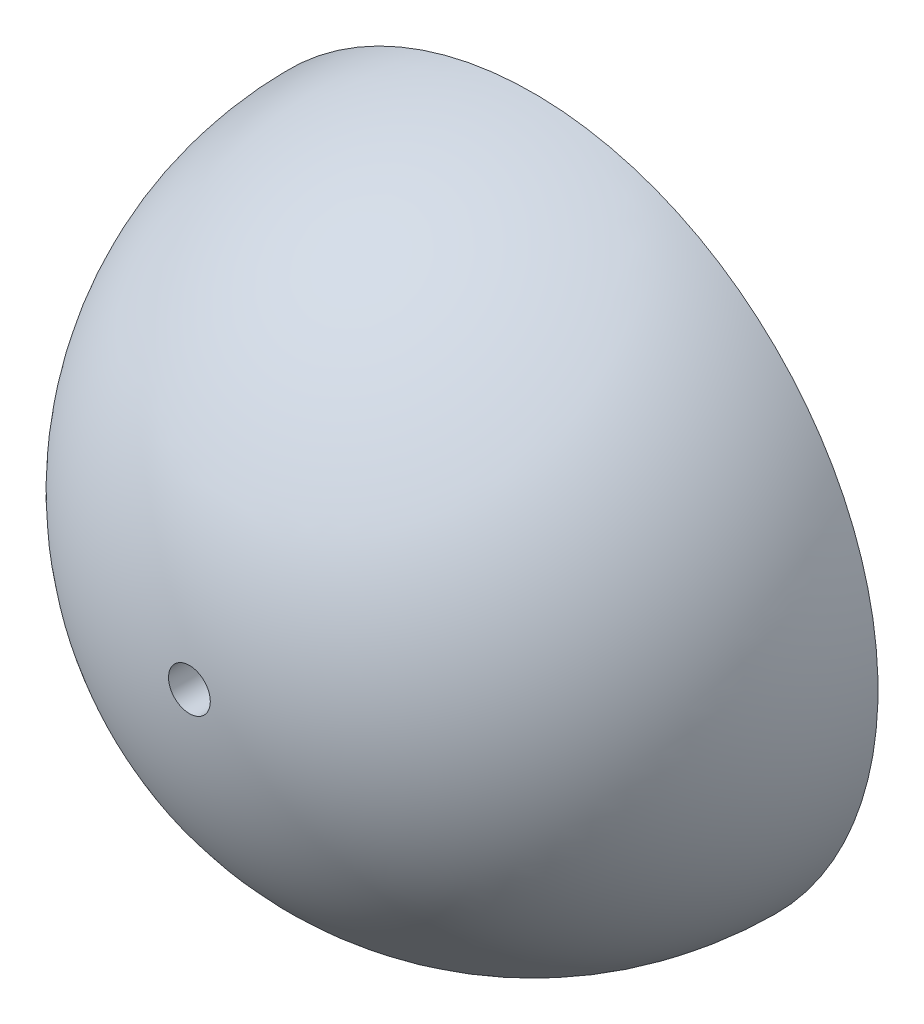
ISO-10303-21;
HEADER;
FILE_DESCRIPTION(('STEP AP214'),'2;1');
FILE_NAME('part.step','',(''),(''),'','','');
FILE_SCHEMA(('AUTOMOTIVE_DESIGN { 1 0 10303 214 1 1 1 1 }'));
ENDSEC;
DATA;
#1=APPLICATION_CONTEXT('core data for automotive mechanical design processes');
#2=APPLICATION_PROTOCOL_DEFINITION('international standard','automotive_design',2000,#1);
#3=PRODUCT_CONTEXT('',#1,'mechanical');
#4=PRODUCT('Part','Part','',(#3));
#5=PRODUCT_RELATED_PRODUCT_CATEGORY('part','',(#4));
#6=PRODUCT_DEFINITION_FORMATION('','',#4);
#7=PRODUCT_DEFINITION_CONTEXT('part definition',#1,'design');
#8=PRODUCT_DEFINITION('design','',#6,#7);
#9=PRODUCT_DEFINITION_SHAPE('','',#8);
#10=(LENGTH_UNIT() NAMED_UNIT(*) SI_UNIT(.MILLI.,.METRE.));
#11=(NAMED_UNIT(*) PLANE_ANGLE_UNIT() SI_UNIT($,.RADIAN.));
#12=(NAMED_UNIT(*) SI_UNIT($,.STERADIAN.) SOLID_ANGLE_UNIT());
#13=UNCERTAINTY_MEASURE_WITH_UNIT(LENGTH_MEASURE(1.E-05),#10,'distance_accuracy_value','');
#14=(GEOMETRIC_REPRESENTATION_CONTEXT(3) GLOBAL_UNCERTAINTY_ASSIGNED_CONTEXT((#13)) GLOBAL_UNIT_ASSIGNED_CONTEXT((#10,
#11,#12)) REPRESENTATION_CONTEXT('',''));
#15=CARTESIAN_POINT('',(0.,0.,0.));
#16=DIRECTION('',(0.,0.,1.));
#17=DIRECTION('',(1.,0.,0.));
#18=AXIS2_PLACEMENT_3D('',#15,#16,#17);
#19=CARTESIAN_POINT('',(1.10283167189489E-12,0.,0.));
#20=DIRECTION('',(0.,1.,0.));
#21=DIRECTION('',(-1.,0.,0.));
#22=AXIS2_PLACEMENT_3D('',#19,#20,#21);
#23=SPHERICAL_SURFACE('',#22,825.);
#24=CARTESIAN_POINT('',(1.10283167189489E-12,0.,0.));
#25=DIRECTION('',(0.,0.,-1.));
#26=DIRECTION('',(-1.,0.,0.));
#27=AXIS2_PLACEMENT_3D('',#24,#25,#26);
#28=SPHERICAL_SURFACE('',#27,825.);
#29=CARTESIAN_POINT('',(0.,0.,823.48345460003));
#30=DIRECTION('',(0.,0.,-1.));
#31=DIRECTION('',(-1.,0.,0.));
#32=AXIS2_PLACEMENT_3D('',#29,#30,#31);
#33=CIRCLE('',#32,50.);
#34=CARTESIAN_POINT('',(50.,0.,823.48345460003));
#35=VERTEX_POINT('',#34);
#36=EDGE_CURVE('E47',#35,#35,#33,.T.);
#37=ORIENTED_EDGE('',*,*,#36,.T.);
#38=EDGE_LOOP('',(#37));
#39=FACE_BOUND('',#38,.T.);
#40=CARTESIAN_POINT('',(1.10283167189489E-12,0.,0.));
#41=DIRECTION('',(0.,0.,-1.));
#42=DIRECTION('',(-1.,0.,0.));
#43=AXIS2_PLACEMENT_3D('',#40,#41,#42);
#44=CIRCLE('',#43,825.);
#45=CARTESIAN_POINT('',(-824.999999999999,1.09589277799098E-12,-5.76094420909117E-12));
#46=VERTEX_POINT('',#45);
#47=EDGE_CURVE('E43',#46,#46,#44,.T.);
#48=ORIENTED_EDGE('',*,*,#47,.F.);
#49=EDGE_LOOP('',(#48));
#50=FACE_BOUND('',#49,.T.);
#51=ADVANCED_FACE('F35',(#39,#50),#28,.T.);
#52=CARTESIAN_POINT('',(1.10283167189489E-12,0.,0.));
#53=DIRECTION('',(0.,1.,0.));
#54=DIRECTION('',(1.,0.,0.));
#55=AXIS2_PLACEMENT_3D('',#52,#53,#54);
#56=SPHERICAL_SURFACE('',#55,700.);
#57=CARTESIAN_POINT('',(1.10283167189489E-12,0.,0.));
#58=DIRECTION('',(0.,0.,-1.));
#59=DIRECTION('',(-1.,0.,0.));
#60=AXIS2_PLACEMENT_3D('',#57,#58,#59);
#61=SPHERICAL_SURFACE('',#60,700.);
#62=CARTESIAN_POINT('',(0.,0.,698.212002188447));
#63=DIRECTION('',(0.,0.,-1.));
#64=DIRECTION('',(-1.,0.,0.));
#65=AXIS2_PLACEMENT_3D('',#62,#63,#64);
#66=CIRCLE('',#65,50.);
#67=CARTESIAN_POINT('',(50.,0.,698.212002188447));
#68=VERTEX_POINT('',#67);
#69=EDGE_CURVE('E39',#68,#68,#66,.F.);
#70=ORIENTED_EDGE('',*,*,#69,.T.);
#71=EDGE_LOOP('',(#70));
#72=FACE_BOUND('',#71,.T.);
#73=CARTESIAN_POINT('',(1.10283167189489E-12,0.,0.));
#74=DIRECTION('',(0.,0.,1.));
#75=DIRECTION('',(-1.,0.,0.));
#76=AXIS2_PLACEMENT_3D('',#73,#74,#75);
#77=CIRCLE('',#76,700.);
#78=CARTESIAN_POINT('',(-699.999999999999,9.28797070128117E-13,-4.88807387438038E-12));
#79=VERTEX_POINT('',#78);
#80=EDGE_CURVE('E10',#79,#79,#77,.T.);
#81=ORIENTED_EDGE('',*,*,#80,.F.);
#82=EDGE_LOOP('',(#81));
#83=FACE_BOUND('',#82,.T.);
#84=ADVANCED_FACE('F37',(#72,#83),#61,.F.);
#85=CARTESIAN_POINT('',(1.10283167189489E-12,0.,0.));
#86=DIRECTION('',(0.,0.,-1.));
#87=DIRECTION('',(-1.,0.,0.));
#88=AXIS2_PLACEMENT_3D('',#85,#86,#87);
#89=PLANE('',#88);
#90=ORIENTED_EDGE('',*,*,#80,.T.);
#91=EDGE_LOOP('',(#90));
#92=FACE_BOUND('',#91,.T.);
#93=ORIENTED_EDGE('',*,*,#47,.T.);
#94=EDGE_LOOP('',(#93));
#95=FACE_BOUND('',#94,.T.);
#96=ADVANCED_FACE('F61',(#92,#95),#89,.T.);
#97=CARTESIAN_POINT('',(0.,0.,-1.2E-05));
#98=DIRECTION('',(0.,0.,1.));
#99=DIRECTION('',(1.,0.,0.));
#100=AXIS2_PLACEMENT_3D('',#97,#98,#99);
#101=CYLINDRICAL_SURFACE('',#100,50.);
#102=CARTESIAN_POINT('',(50.,0.,698.212002188447));
#103=CARTESIAN_POINT('',(50.,0.,699.516913151068));
#104=CARTESIAN_POINT('',(50.,0.,700.821824113688));
#105=CARTESIAN_POINT('',(50.,0.,703.43164603893));
#106=CARTESIAN_POINT('',(50.,0.,704.73655700155));
#107=CARTESIAN_POINT('',(50.,0.,707.346378926792));
#108=CARTESIAN_POINT('',(50.,0.,708.651289889412));
#109=CARTESIAN_POINT('',(50.,0.,711.261111814654));
#110=CARTESIAN_POINT('',(50.,0.,712.566022777274));
#111=CARTESIAN_POINT('',(50.,0.,715.175844702516));
#112=CARTESIAN_POINT('',(50.,0.,716.480755665136));
#113=CARTESIAN_POINT('',(50.,0.,719.090577590378));
#114=CARTESIAN_POINT('',(50.,0.,720.395488552998));
#115=CARTESIAN_POINT('',(50.,0.,723.005310478239));
#116=CARTESIAN_POINT('',(50.,0.,724.31022144086));
#117=CARTESIAN_POINT('',(50.,0.,726.920043366101));
#118=CARTESIAN_POINT('',(50.,0.,728.224954328722));
#119=CARTESIAN_POINT('',(50.,0.,730.834776253963));
#120=CARTESIAN_POINT('',(50.,0.,732.139687216584));
#121=CARTESIAN_POINT('',(50.,0.,734.749509141825));
#122=CARTESIAN_POINT('',(50.,0.,736.054420104446));
#123=CARTESIAN_POINT('',(50.,0.,738.664242029687));
#124=CARTESIAN_POINT('',(50.,0.,739.969152992308));
#125=CARTESIAN_POINT('',(50.,0.,742.578974917549));
#126=CARTESIAN_POINT('',(50.,0.,743.88388588017));
#127=CARTESIAN_POINT('',(50.,0.,746.493707805411));
#128=CARTESIAN_POINT('',(50.,0.,747.798618768032));
#129=CARTESIAN_POINT('',(50.,0.,750.408440693273));
#130=CARTESIAN_POINT('',(50.,0.,751.713351655894));
#131=CARTESIAN_POINT('',(50.,0.,754.323173581135));
#132=CARTESIAN_POINT('',(50.,0.,755.628084543756));
#133=CARTESIAN_POINT('',(50.,0.,758.237906468997));
#134=CARTESIAN_POINT('',(50.,0.,759.542817431618));
#135=CARTESIAN_POINT('',(50.,0.,762.152639356859));
#136=CARTESIAN_POINT('',(50.,0.,763.45755031948));
#137=CARTESIAN_POINT('',(50.,0.,766.067372244721));
#138=CARTESIAN_POINT('',(50.,0.,767.372283207342));
#139=CARTESIAN_POINT('',(50.,0.,769.982105132583));
#140=CARTESIAN_POINT('',(50.,0.,771.287016095204));
#141=CARTESIAN_POINT('',(50.,0.,773.896838020445));
#142=CARTESIAN_POINT('',(50.,0.,775.201748983066));
#143=CARTESIAN_POINT('',(50.,0.,777.811570908307));
#144=CARTESIAN_POINT('',(50.,0.,779.116481870928));
#145=CARTESIAN_POINT('',(50.,0.,781.726303796169));
#146=CARTESIAN_POINT('',(50.,0.,783.03121475879));
#147=CARTESIAN_POINT('',(50.,0.,785.641036684031));
#148=CARTESIAN_POINT('',(50.,0.,786.945947646652));
#149=CARTESIAN_POINT('',(50.,0.,789.555769571893));
#150=CARTESIAN_POINT('',(50.,0.,790.860680534514));
#151=CARTESIAN_POINT('',(50.,0.,793.470502459755));
#152=CARTESIAN_POINT('',(50.,0.,794.775413422376));
#153=CARTESIAN_POINT('',(50.,0.,797.385235347617));
#154=CARTESIAN_POINT('',(50.,0.,798.690146310238));
#155=CARTESIAN_POINT('',(50.,0.,801.299968235479));
#156=CARTESIAN_POINT('',(50.,0.,802.6048791981));
#157=CARTESIAN_POINT('',(50.,0.,805.214701123341));
#158=CARTESIAN_POINT('',(50.,0.,806.519612085962));
#159=CARTESIAN_POINT('',(50.,0.,809.129434011203));
#160=CARTESIAN_POINT('',(50.,0.,810.434344973823));
#161=CARTESIAN_POINT('',(50.,0.,813.044166899065));
#162=CARTESIAN_POINT('',(50.,0.,814.349077861685));
#163=CARTESIAN_POINT('',(50.,0.,816.958899786927));
#164=CARTESIAN_POINT('',(50.,0.,818.263810749547));
#165=CARTESIAN_POINT('',(50.,0.,820.873632674789));
#166=CARTESIAN_POINT('',(50.,0.,822.178543637409));
#167=CARTESIAN_POINT('',(50.,0.,823.48345460003));
#168=B_SPLINE_CURVE_WITH_KNOTS('',3,(#102,#103,#104,#105,#106,#107,#108,#109,#110,#111,#112,
#113,#114,#115,#116,#117,#118,#119,#120,#121,#122,#123,#124,#125,#126,#127,#128,#129,#130,#131,
#132,#133,#134,#135,#136,#137,#138,#139,#140,#141,#142,#143,#144,#145,#146,#147,#148,#149,#150,
#151,#152,#153,#154,#155,#156,#157,#158,#159,#160,#161,#162,#163,#164,#165,#166,#167),
.UNSPECIFIED.,.F.,.F.,(4,2,2,2,2,2,2,2,2,2,2,2,2,2,2,2,2,2,2,2,2,2,2,2,2,2,2,2,2,2,2,2,4),(0.,
3.91473288786193,7.82946577572396,11.7441986635859,15.6589315514479,19.5736644393099,
23.4883973271718,27.4031302150338,31.3178631028957,35.2325959907577,39.1473288786197,
43.0620617664816,46.9767946543436,50.8915275422056,54.8062604300675,58.7209933179296,
62.6357262057915,66.5504590936534,70.4651919815155,74.3799248693774,78.2946577572394,
82.2093906451014,86.1241235329633,90.0388564208253,93.9535893086872,97.8683221965492,
101.783055084411,105.697787972273,109.612520860135,113.527253747997,117.441986635859,
121.356719523721,125.271452411583),.UNSPECIFIED.);
#169=EDGE_CURVE('BSEAM58',#68,#35,#168,.T.);
#170=ORIENTED_EDGE('',*,*,#69,.F.);
#171=ORIENTED_EDGE('',*,*,#36,.F.);
#172=ORIENTED_EDGE('',*,*,#169,.T.);
#173=ORIENTED_EDGE('',*,*,#169,.F.);
#174=EDGE_LOOP('',(#170,#172,#171,#173));
#175=FACE_BOUND('',#174,.T.);
#176=ADVANCED_FACE('F58',(#175),#101,.F.);
#177=CLOSED_SHELL('',(#51,#84,#96,#176));
#178=MANIFOLD_SOLID_BREP('B2',#177);
#179=ADVANCED_BREP_SHAPE_REPRESENTATION('',(#18,#178),#14);
#180=SHAPE_DEFINITION_REPRESENTATION(#9,#179);
ENDSEC;
END-ISO-10303-21;
